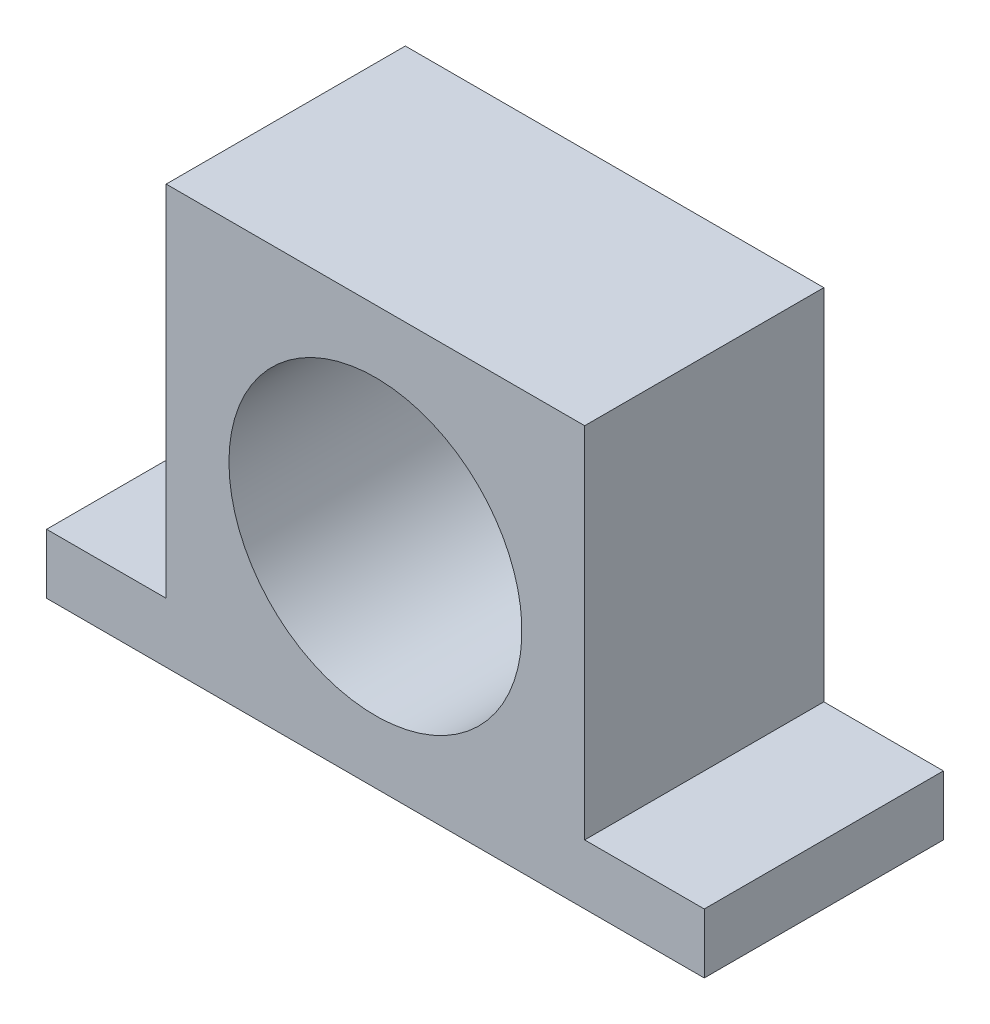
ISO-10303-21;
HEADER;
FILE_DESCRIPTION(('STEP AP214'),'2;1');
FILE_NAME('part.step','',(''),(''),'','','');
FILE_SCHEMA(('AUTOMOTIVE_DESIGN { 1 0 10303 214 1 1 1 1 }'));
ENDSEC;
DATA;
#1=APPLICATION_CONTEXT('core data for automotive mechanical design processes');
#2=APPLICATION_PROTOCOL_DEFINITION('international standard','automotive_design',2000,#1);
#3=PRODUCT_CONTEXT('',#1,'mechanical');
#4=PRODUCT('Part','Part','',(#3));
#5=PRODUCT_RELATED_PRODUCT_CATEGORY('part','',(#4));
#6=PRODUCT_DEFINITION_FORMATION('','',#4);
#7=PRODUCT_DEFINITION_CONTEXT('part definition',#1,'design');
#8=PRODUCT_DEFINITION('design','',#6,#7);
#9=PRODUCT_DEFINITION_SHAPE('','',#8);
#10=(LENGTH_UNIT() NAMED_UNIT(*) SI_UNIT(.MILLI.,.METRE.));
#11=(NAMED_UNIT(*) PLANE_ANGLE_UNIT() SI_UNIT($,.RADIAN.));
#12=(NAMED_UNIT(*) SI_UNIT($,.STERADIAN.) SOLID_ANGLE_UNIT());
#13=UNCERTAINTY_MEASURE_WITH_UNIT(LENGTH_MEASURE(1.E-05),#10,'distance_accuracy_value','');
#14=(GEOMETRIC_REPRESENTATION_CONTEXT(3) GLOBAL_UNCERTAINTY_ASSIGNED_CONTEXT((#13)) GLOBAL_UNIT_ASSIGNED_CONTEXT((#10,
#11,#12)) REPRESENTATION_CONTEXT('',''));
#15=CARTESIAN_POINT('',(0.,0.,0.));
#16=DIRECTION('',(0.,0.,1.));
#17=DIRECTION('',(1.,0.,0.));
#18=AXIS2_PLACEMENT_3D('',#15,#16,#17);
#19=CARTESIAN_POINT('',(-22.225,-15.875,25.4));
#20=DIRECTION('',(-1.,0.,0.));
#21=DIRECTION('',(0.,-1.,0.));
#22=AXIS2_PLACEMENT_3D('',#19,#20,#21);
#23=PLANE('',#22);
#24=DIRECTION('',(0.,1.,0.));
#25=VECTOR('',#24,1.);
#26=CARTESIAN_POINT('',(-22.225,-15.875,0.));
#27=LINE('',#26,#25);
#28=CARTESIAN_POINT('',(-22.225,-15.875,0.));
#29=VERTEX_POINT('',#28);
#30=CARTESIAN_POINT('',(-22.225,22.225,0.));
#31=VERTEX_POINT('',#30);
#32=EDGE_CURVE('E144',#29,#31,#27,.T.);
#33=ORIENTED_EDGE('',*,*,#32,.F.);
#34=DIRECTION('',(0.,0.,-1.));
#35=VECTOR('',#34,1.);
#36=CARTESIAN_POINT('',(-22.225,-15.875,25.4));
#37=LINE('',#36,#35);
#38=CARTESIAN_POINT('',(-22.225,-15.875,25.4));
#39=VERTEX_POINT('',#38);
#40=EDGE_CURVE('E11',#39,#29,#37,.T.);
#41=ORIENTED_EDGE('',*,*,#40,.F.);
#42=DIRECTION('',(0.,1.,0.));
#43=VECTOR('',#42,1.);
#44=CARTESIAN_POINT('',(-22.225,-15.875,25.4));
#45=LINE('',#44,#43);
#46=CARTESIAN_POINT('',(-22.225,22.225,25.4));
#47=VERTEX_POINT('',#46);
#48=EDGE_CURVE('E173',#39,#47,#45,.T.);
#49=ORIENTED_EDGE('',*,*,#48,.T.);
#50=DIRECTION('',(0.,0.,-1.));
#51=VECTOR('',#50,1.);
#52=CARTESIAN_POINT('',(-22.225,22.225,25.4));
#53=LINE('',#52,#51);
#54=EDGE_CURVE('E48',#47,#31,#53,.T.);
#55=ORIENTED_EDGE('',*,*,#54,.T.);
#56=EDGE_LOOP('',(#33,#41,#49,#55));
#57=FACE_BOUND('',#56,.T.);
#58=ADVANCED_FACE('F45',(#57),#23,.T.);
#59=CARTESIAN_POINT('',(-34.925,-15.875,25.4));
#60=DIRECTION('',(0.,1.,0.));
#61=DIRECTION('',(-1.,0.,0.));
#62=AXIS2_PLACEMENT_3D('',#59,#60,#61);
#63=PLANE('',#62);
#64=DIRECTION('',(1.,0.,0.));
#65=VECTOR('',#64,1.);
#66=CARTESIAN_POINT('',(-34.925,-15.875,0.));
#67=LINE('',#66,#65);
#68=CARTESIAN_POINT('',(-34.925,-15.875,0.));
#69=VERTEX_POINT('',#68);
#70=EDGE_CURVE('E170',#69,#29,#67,.T.);
#71=ORIENTED_EDGE('',*,*,#70,.F.);
#72=DIRECTION('',(0.,0.,-1.));
#73=VECTOR('',#72,1.);
#74=CARTESIAN_POINT('',(-34.925,-15.875,25.4));
#75=LINE('',#74,#73);
#76=CARTESIAN_POINT('',(-34.925,-15.875,25.4));
#77=VERTEX_POINT('',#76);
#78=EDGE_CURVE('E55',#77,#69,#75,.T.);
#79=ORIENTED_EDGE('',*,*,#78,.F.);
#80=DIRECTION('',(1.,0.,0.));
#81=VECTOR('',#80,1.);
#82=CARTESIAN_POINT('',(-34.925,-15.875,25.4));
#83=LINE('',#82,#81);
#84=EDGE_CURVE('E137',#77,#39,#83,.T.);
#85=ORIENTED_EDGE('',*,*,#84,.T.);
#86=ORIENTED_EDGE('',*,*,#40,.T.);
#87=EDGE_LOOP('',(#71,#79,#85,#86));
#88=FACE_BOUND('',#87,.T.);
#89=ADVANCED_FACE('F192',(#88),#63,.T.);
#90=CARTESIAN_POINT('',(-34.925,-22.225,25.4));
#91=DIRECTION('',(-1.,0.,0.));
#92=DIRECTION('',(0.,0.,1.));
#93=AXIS2_PLACEMENT_3D('',#90,#91,#92);
#94=PLANE('',#93);
#95=DIRECTION('',(0.,1.,0.));
#96=VECTOR('',#95,1.);
#97=CARTESIAN_POINT('',(-34.925,-22.225,0.));
#98=LINE('',#97,#96);
#99=CARTESIAN_POINT('',(-34.925,-22.225,0.));
#100=VERTEX_POINT('',#99);
#101=EDGE_CURVE('E121',#100,#69,#98,.T.);
#102=ORIENTED_EDGE('',*,*,#101,.F.);
#103=DIRECTION('',(0.,0.,-1.));
#104=VECTOR('',#103,1.);
#105=CARTESIAN_POINT('',(-34.925,-22.225,25.4));
#106=LINE('',#105,#104);
#107=CARTESIAN_POINT('',(-34.925,-22.225,25.4));
#108=VERTEX_POINT('',#107);
#109=EDGE_CURVE('E115',#108,#100,#106,.T.);
#110=ORIENTED_EDGE('',*,*,#109,.F.);
#111=DIRECTION('',(0.,1.,0.));
#112=VECTOR('',#111,1.);
#113=CARTESIAN_POINT('',(-34.925,-22.225,25.4));
#114=LINE('',#113,#112);
#115=EDGE_CURVE('E119',#108,#77,#114,.T.);
#116=ORIENTED_EDGE('',*,*,#115,.T.);
#117=ORIENTED_EDGE('',*,*,#78,.T.);
#118=EDGE_LOOP('',(#102,#110,#116,#117));
#119=FACE_BOUND('',#118,.T.);
#120=ADVANCED_FACE('F117',(#119),#94,.T.);
#121=CARTESIAN_POINT('',(-34.925,-22.225,25.4));
#122=DIRECTION('',(0.,1.,0.));
#123=DIRECTION('',(0.,0.,1.));
#124=AXIS2_PLACEMENT_3D('',#121,#122,#123);
#125=PLANE('',#124);
#126=DIRECTION('',(1.,0.,0.));
#127=VECTOR('',#126,1.);
#128=CARTESIAN_POINT('',(-34.925,-22.225,0.));
#129=LINE('',#128,#127);
#130=CARTESIAN_POINT('',(34.925,-22.225,0.));
#131=VERTEX_POINT('',#130);
#132=EDGE_CURVE('E165',#100,#131,#129,.T.);
#133=ORIENTED_EDGE('',*,*,#132,.T.);
#134=DIRECTION('',(0.,0.,-1.));
#135=VECTOR('',#134,1.);
#136=CARTESIAN_POINT('',(34.925,-22.225,25.4));
#137=LINE('',#136,#135);
#138=CARTESIAN_POINT('',(34.925,-22.225,25.4));
#139=VERTEX_POINT('',#138);
#140=EDGE_CURVE('E125',#139,#131,#137,.T.);
#141=ORIENTED_EDGE('',*,*,#140,.F.);
#142=DIRECTION('',(1.,0.,0.));
#143=VECTOR('',#142,1.);
#144=CARTESIAN_POINT('',(-34.925,-22.225,25.4));
#145=LINE('',#144,#143);
#146=EDGE_CURVE('E128',#108,#139,#145,.T.);
#147=ORIENTED_EDGE('',*,*,#146,.F.);
#148=ORIENTED_EDGE('',*,*,#109,.T.);
#149=EDGE_LOOP('',(#133,#141,#147,#148));
#150=FACE_BOUND('',#149,.T.);
#151=ADVANCED_FACE('F129',(#150),#125,.F.);
#152=CARTESIAN_POINT('',(34.925,-22.225,25.4));
#153=DIRECTION('',(-1.,0.,0.));
#154=DIRECTION('',(0.,0.,1.));
#155=AXIS2_PLACEMENT_3D('',#152,#153,#154);
#156=PLANE('',#155);
#157=DIRECTION('',(0.,1.,0.));
#158=VECTOR('',#157,1.);
#159=CARTESIAN_POINT('',(34.925,-22.225,0.));
#160=LINE('',#159,#158);
#161=CARTESIAN_POINT('',(34.925,-15.875,0.));
#162=VERTEX_POINT('',#161);
#163=EDGE_CURVE('E161',#131,#162,#160,.T.);
#164=ORIENTED_EDGE('',*,*,#163,.T.);
#165=DIRECTION('',(0.,0.,-1.));
#166=VECTOR('',#165,1.);
#167=CARTESIAN_POINT('',(34.925,-15.875,25.4));
#168=LINE('',#167,#166);
#169=CARTESIAN_POINT('',(34.925,-15.875,25.4));
#170=VERTEX_POINT('',#169);
#171=EDGE_CURVE('E179',#170,#162,#168,.T.);
#172=ORIENTED_EDGE('',*,*,#171,.F.);
#173=DIRECTION('',(0.,1.,0.));
#174=VECTOR('',#173,1.);
#175=CARTESIAN_POINT('',(34.925,-22.225,25.4));
#176=LINE('',#175,#174);
#177=EDGE_CURVE('E134',#139,#170,#176,.T.);
#178=ORIENTED_EDGE('',*,*,#177,.F.);
#179=ORIENTED_EDGE('',*,*,#140,.T.);
#180=EDGE_LOOP('',(#164,#172,#178,#179));
#181=FACE_BOUND('',#180,.T.);
#182=ADVANCED_FACE('F205',(#181),#156,.F.);
#183=CARTESIAN_POINT('',(22.225,-15.875,25.4));
#184=DIRECTION('',(0.,1.,0.));
#185=DIRECTION('',(0.,0.,1.));
#186=AXIS2_PLACEMENT_3D('',#183,#184,#185);
#187=PLANE('',#186);
#188=DIRECTION('',(1.,0.,0.));
#189=VECTOR('',#188,1.);
#190=CARTESIAN_POINT('',(22.225,-15.875,0.));
#191=LINE('',#190,#189);
#192=CARTESIAN_POINT('',(22.225,-15.875,0.));
#193=VERTEX_POINT('',#192);
#194=EDGE_CURVE('E157',#193,#162,#191,.T.);
#195=ORIENTED_EDGE('',*,*,#194,.F.);
#196=DIRECTION('',(0.,0.,-1.));
#197=VECTOR('',#196,1.);
#198=CARTESIAN_POINT('',(22.225,-15.875,25.4));
#199=LINE('',#198,#197);
#200=CARTESIAN_POINT('',(22.225,-15.875,25.4));
#201=VERTEX_POINT('',#200);
#202=EDGE_CURVE('E182',#201,#193,#199,.T.);
#203=ORIENTED_EDGE('',*,*,#202,.F.);
#204=DIRECTION('',(1.,0.,0.));
#205=VECTOR('',#204,1.);
#206=CARTESIAN_POINT('',(22.225,-15.875,25.4));
#207=LINE('',#206,#205);
#208=EDGE_CURVE('E250',#201,#170,#207,.T.);
#209=ORIENTED_EDGE('',*,*,#208,.T.);
#210=ORIENTED_EDGE('',*,*,#171,.T.);
#211=EDGE_LOOP('',(#195,#203,#209,#210));
#212=FACE_BOUND('',#211,.T.);
#213=ADVANCED_FACE('F208',(#212),#187,.T.);
#214=CARTESIAN_POINT('',(22.225,-15.875,25.4));
#215=DIRECTION('',(-1.,0.,0.));
#216=DIRECTION('',(0.,0.,1.));
#217=AXIS2_PLACEMENT_3D('',#214,#215,#216);
#218=PLANE('',#217);
#219=DIRECTION('',(0.,1.,0.));
#220=VECTOR('',#219,1.);
#221=CARTESIAN_POINT('',(22.225,-15.875,0.));
#222=LINE('',#221,#220);
#223=CARTESIAN_POINT('',(22.225,22.225,0.));
#224=VERTEX_POINT('',#223);
#225=EDGE_CURVE('E153',#193,#224,#222,.T.);
#226=ORIENTED_EDGE('',*,*,#225,.T.);
#227=DIRECTION('',(0.,0.,-1.));
#228=VECTOR('',#227,1.);
#229=CARTESIAN_POINT('',(22.225,22.225,25.4));
#230=LINE('',#229,#228);
#231=CARTESIAN_POINT('',(22.225,22.225,25.4));
#232=VERTEX_POINT('',#231);
#233=EDGE_CURVE('E184',#232,#224,#230,.T.);
#234=ORIENTED_EDGE('',*,*,#233,.F.);
#235=DIRECTION('',(0.,1.,0.));
#236=VECTOR('',#235,1.);
#237=CARTESIAN_POINT('',(22.225,-15.875,25.4));
#238=LINE('',#237,#236);
#239=EDGE_CURVE('E247',#201,#232,#238,.T.);
#240=ORIENTED_EDGE('',*,*,#239,.F.);
#241=ORIENTED_EDGE('',*,*,#202,.T.);
#242=EDGE_LOOP('',(#226,#234,#240,#241));
#243=FACE_BOUND('',#242,.T.);
#244=ADVANCED_FACE('F212',(#243),#218,.F.);
#245=CARTESIAN_POINT('',(-22.225,22.225,25.4));
#246=DIRECTION('',(0.,1.,0.));
#247=DIRECTION('',(0.,0.,1.));
#248=AXIS2_PLACEMENT_3D('',#245,#246,#247);
#249=PLANE('',#248);
#250=DIRECTION('',(1.,0.,0.));
#251=VECTOR('',#250,1.);
#252=CARTESIAN_POINT('',(-22.225,22.225,0.));
#253=LINE('',#252,#251);
#254=EDGE_CURVE('E148',#31,#224,#253,.T.);
#255=ORIENTED_EDGE('',*,*,#254,.F.);
#256=ORIENTED_EDGE('',*,*,#54,.F.);
#257=DIRECTION('',(1.,0.,0.));
#258=VECTOR('',#257,1.);
#259=CARTESIAN_POINT('',(-22.225,22.225,25.4));
#260=LINE('',#259,#258);
#261=EDGE_CURVE('E244',#47,#232,#260,.T.);
#262=ORIENTED_EDGE('',*,*,#261,.T.);
#263=ORIENTED_EDGE('',*,*,#233,.T.);
#264=EDGE_LOOP('',(#255,#256,#262,#263));
#265=FACE_BOUND('',#264,.T.);
#266=ADVANCED_FACE('F188',(#265),#249,.T.);
#267=CARTESIAN_POINT('',(0.,0.,25.4));
#268=DIRECTION('',(0.,0.,-1.));
#269=DIRECTION('',(-1.,0.,0.));
#270=AXIS2_PLACEMENT_3D('',#267,#268,#269);
#271=PLANE('',#270);
#272=CARTESIAN_POINT('',(0.,0.,25.4));
#273=DIRECTION('',(0.,0.,-1.));
#274=DIRECTION('',(-1.,0.,0.));
#275=AXIS2_PLACEMENT_3D('',#272,#273,#274);
#276=CIRCLE('',#275,15.5575);
#277=CARTESIAN_POINT('',(-15.5575,0.,25.4));
#278=VERTEX_POINT('',#277);
#279=EDGE_CURVE('E149',#278,#278,#276,.T.);
#280=ORIENTED_EDGE('',*,*,#279,.T.);
#281=EDGE_LOOP('',(#280));
#282=FACE_BOUND('',#281,.T.);
#283=ORIENTED_EDGE('',*,*,#48,.F.);
#284=ORIENTED_EDGE('',*,*,#84,.F.);
#285=ORIENTED_EDGE('',*,*,#115,.F.);
#286=ORIENTED_EDGE('',*,*,#146,.T.);
#287=ORIENTED_EDGE('',*,*,#177,.T.);
#288=ORIENTED_EDGE('',*,*,#208,.F.);
#289=ORIENTED_EDGE('',*,*,#239,.T.);
#290=ORIENTED_EDGE('',*,*,#261,.F.);
#291=EDGE_LOOP('',(#283,#284,#285,#286,#287,#288,#289,#290));
#292=FACE_BOUND('',#291,.T.);
#293=ADVANCED_FACE('F136',(#282,#292),#271,.F.);
#294=CARTESIAN_POINT('',(0.,0.,0.));
#295=DIRECTION('',(0.,0.,-1.));
#296=DIRECTION('',(-1.,0.,0.));
#297=AXIS2_PLACEMENT_3D('',#294,#295,#296);
#298=PLANE('',#297);
#299=CARTESIAN_POINT('',(0.,0.,0.));
#300=DIRECTION('',(0.,0.,-1.));
#301=DIRECTION('',(-1.,0.,0.));
#302=AXIS2_PLACEMENT_3D('',#299,#300,#301);
#303=CIRCLE('',#302,15.5575);
#304=CARTESIAN_POINT('',(-15.5575,0.,0.));
#305=VERTEX_POINT('',#304);
#306=EDGE_CURVE('E236',#305,#305,#303,.T.);
#307=ORIENTED_EDGE('',*,*,#306,.F.);
#308=EDGE_LOOP('',(#307));
#309=FACE_BOUND('',#308,.T.);
#310=ORIENTED_EDGE('',*,*,#32,.T.);
#311=ORIENTED_EDGE('',*,*,#254,.T.);
#312=ORIENTED_EDGE('',*,*,#225,.F.);
#313=ORIENTED_EDGE('',*,*,#194,.T.);
#314=ORIENTED_EDGE('',*,*,#163,.F.);
#315=ORIENTED_EDGE('',*,*,#132,.F.);
#316=ORIENTED_EDGE('',*,*,#101,.T.);
#317=ORIENTED_EDGE('',*,*,#70,.T.);
#318=EDGE_LOOP('',(#310,#311,#312,#313,#314,#315,#316,#317));
#319=FACE_BOUND('',#318,.T.);
#320=ADVANCED_FACE('F191',(#309,#319),#298,.T.);
#321=CARTESIAN_POINT('',(0.,0.,25.4));
#322=DIRECTION('',(0.,0.,-1.));
#323=DIRECTION('',(-1.,0.,0.));
#324=AXIS2_PLACEMENT_3D('',#321,#322,#323);
#325=CYLINDRICAL_SURFACE('',#324,15.5575);
#326=ORIENTED_EDGE('',*,*,#279,.F.);
#327=EDGE_LOOP('',(#326));
#328=FACE_BOUND('',#327,.T.);
#329=ORIENTED_EDGE('',*,*,#306,.T.);
#330=EDGE_LOOP('',(#329));
#331=FACE_BOUND('',#330,.T.);
#332=ADVANCED_FACE('F224',(#328,#331),#325,.F.);
#333=CLOSED_SHELL('',(#58,#89,#120,#151,#182,#213,#244,#266,#293,#320,#332));
#334=MANIFOLD_SOLID_BREP('B2',#333);
#335=ADVANCED_BREP_SHAPE_REPRESENTATION('',(#18,#334),#14);
#336=SHAPE_DEFINITION_REPRESENTATION(#9,#335);
ENDSEC;
END-ISO-10303-21;
